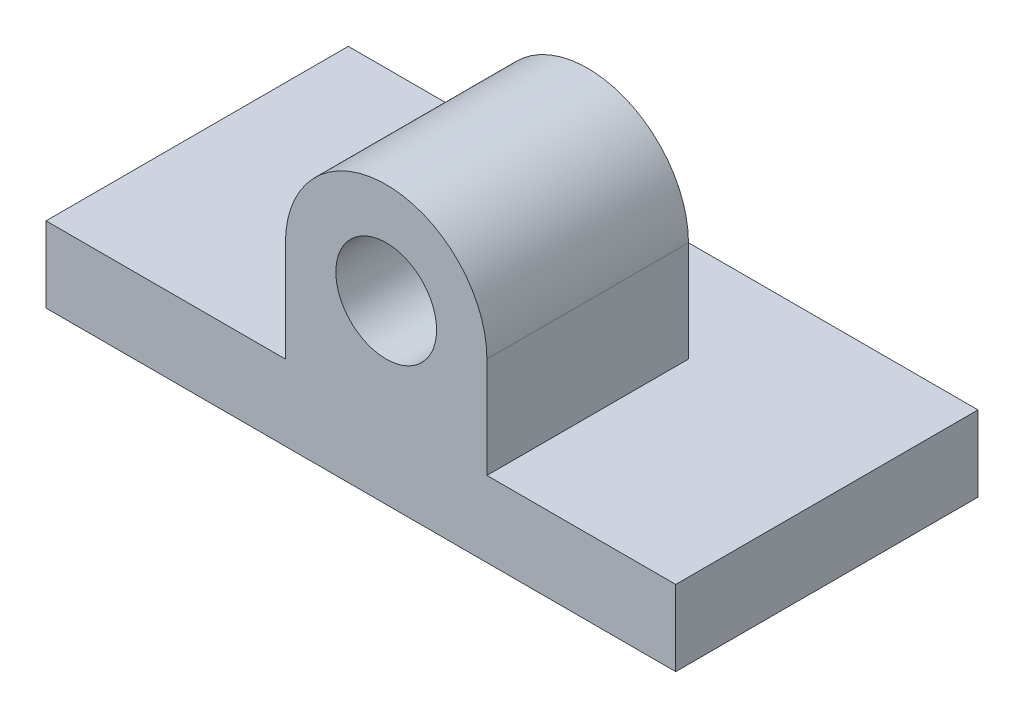
ISO-10303-21;
HEADER;
FILE_DESCRIPTION(('STEP AP214'),'2;1');
FILE_NAME('part.step','',(''),(''),'','','');
FILE_SCHEMA(('AUTOMOTIVE_DESIGN { 1 0 10303 214 1 1 1 1 }'));
ENDSEC;
DATA;
#1=APPLICATION_CONTEXT('core data for automotive mechanical design processes');
#2=APPLICATION_PROTOCOL_DEFINITION('international standard','automotive_design',2000,#1);
#3=PRODUCT_CONTEXT('',#1,'mechanical');
#4=PRODUCT('Part','Part','',(#3));
#5=PRODUCT_RELATED_PRODUCT_CATEGORY('part','',(#4));
#6=PRODUCT_DEFINITION_FORMATION('','',#4);
#7=PRODUCT_DEFINITION_CONTEXT('part definition',#1,'design');
#8=PRODUCT_DEFINITION('design','',#6,#7);
#9=PRODUCT_DEFINITION_SHAPE('','',#8);
#10=(LENGTH_UNIT() NAMED_UNIT(*) SI_UNIT(.MILLI.,.METRE.));
#11=(NAMED_UNIT(*) PLANE_ANGLE_UNIT() SI_UNIT($,.RADIAN.));
#12=(NAMED_UNIT(*) SI_UNIT($,.STERADIAN.) SOLID_ANGLE_UNIT());
#13=UNCERTAINTY_MEASURE_WITH_UNIT(LENGTH_MEASURE(1.E-05),#10,'distance_accuracy_value','');
#14=(GEOMETRIC_REPRESENTATION_CONTEXT(3) GLOBAL_UNCERTAINTY_ASSIGNED_CONTEXT((#13)) GLOBAL_UNIT_ASSIGNED_CONTEXT((#10,
#11,#12)) REPRESENTATION_CONTEXT('',''));
#15=CARTESIAN_POINT('',(0.,0.,0.));
#16=DIRECTION('',(0.,0.,1.));
#17=DIRECTION('',(1.,0.,0.));
#18=AXIS2_PLACEMENT_3D('',#15,#16,#17);
#19=CARTESIAN_POINT('',(0.,15.,-60.));
#20=DIRECTION('',(0.,-1.,0.));
#21=DIRECTION('',(0.,0.,-1.));
#22=AXIS2_PLACEMENT_3D('',#19,#20,#21);
#23=PLANE('',#22);
#24=DIRECTION('',(0.,0.,1.));
#25=VECTOR('',#24,1.);
#26=CARTESIAN_POINT('',(47.527127472847,15.,-40.));
#27=LINE('',#26,#25);
#28=CARTESIAN_POINT('',(47.527127472847,15.,-40.));
#29=VERTEX_POINT('',#28);
#30=CARTESIAN_POINT('',(47.527127472847,15.,0.));
#31=VERTEX_POINT('',#30);
#32=EDGE_CURVE('E131',#29,#31,#27,.T.);
#33=ORIENTED_EDGE('',*,*,#32,.F.);
#34=DIRECTION('',(1.,0.,0.));
#35=VECTOR('',#34,1.);
#36=CARTESIAN_POINT('',(0.,15.,-40.));
#37=LINE('',#36,#35);
#38=CARTESIAN_POINT('',(87.5271274728471,15.,-40.));
#39=VERTEX_POINT('',#38);
#40=EDGE_CURVE('E125',#29,#39,#37,.T.);
#41=ORIENTED_EDGE('',*,*,#40,.T.);
#42=DIRECTION('',(0.,0.,1.));
#43=VECTOR('',#42,1.);
#44=CARTESIAN_POINT('',(87.5271274728471,15.,-40.));
#45=LINE('',#44,#43);
#46=CARTESIAN_POINT('',(87.5271274728471,15.,0.));
#47=VERTEX_POINT('',#46);
#48=EDGE_CURVE('E154',#39,#47,#45,.T.);
#49=ORIENTED_EDGE('',*,*,#48,.T.);
#50=DIRECTION('',(1.,0.,0.));
#51=VECTOR('',#50,1.);
#52=CARTESIAN_POINT('',(0.,15.,0.));
#53=LINE('',#52,#51);
#54=CARTESIAN_POINT('',(125.,15.,0.));
#55=VERTEX_POINT('',#54);
#56=EDGE_CURVE('E169',#47,#55,#53,.T.);
#57=ORIENTED_EDGE('',*,*,#56,.T.);
#58=DIRECTION('',(0.,0.,1.));
#59=VECTOR('',#58,1.);
#60=CARTESIAN_POINT('',(125.,15.,-60.));
#61=LINE('',#60,#59);
#62=CARTESIAN_POINT('',(125.,15.,-60.));
#63=VERTEX_POINT('',#62);
#64=EDGE_CURVE('E47',#63,#55,#61,.T.);
#65=ORIENTED_EDGE('',*,*,#64,.F.);
#66=DIRECTION('',(1.,0.,0.));
#67=VECTOR('',#66,1.);
#68=CARTESIAN_POINT('',(0.,15.,-60.));
#69=LINE('',#68,#67);
#70=CARTESIAN_POINT('',(0.,15.,-60.));
#71=VERTEX_POINT('',#70);
#72=EDGE_CURVE('E93',#71,#63,#69,.T.);
#73=ORIENTED_EDGE('',*,*,#72,.F.);
#74=DIRECTION('',(0.,0.,1.));
#75=VECTOR('',#74,1.);
#76=CARTESIAN_POINT('',(0.,15.,-60.));
#77=LINE('',#76,#75);
#78=CARTESIAN_POINT('',(0.,15.,0.));
#79=VERTEX_POINT('',#78);
#80=EDGE_CURVE('E11',#71,#79,#77,.T.);
#81=ORIENTED_EDGE('',*,*,#80,.T.);
#82=EDGE_CURVE('E166',#79,#31,#53,.T.);
#83=ORIENTED_EDGE('',*,*,#82,.T.);
#84=EDGE_LOOP('',(#33,#41,#49,#57,#65,#73,#81,#83));
#85=FACE_BOUND('',#84,.T.);
#86=ADVANCED_FACE('F41',(#85),#23,.F.);
#87=CARTESIAN_POINT('',(0.,0.,-60.));
#88=DIRECTION('',(1.,0.,0.));
#89=DIRECTION('',(0.,0.,-1.));
#90=AXIS2_PLACEMENT_3D('',#87,#88,#89);
#91=PLANE('',#90);
#92=DIRECTION('',(0.,1.,0.));
#93=VECTOR('',#92,1.);
#94=CARTESIAN_POINT('',(0.,0.,0.));
#95=LINE('',#94,#93);
#96=CARTESIAN_POINT('',(0.,0.,0.));
#97=VERTEX_POINT('',#96);
#98=EDGE_CURVE('E152',#97,#79,#95,.T.);
#99=ORIENTED_EDGE('',*,*,#98,.T.);
#100=ORIENTED_EDGE('',*,*,#80,.F.);
#101=DIRECTION('',(0.,1.,0.));
#102=VECTOR('',#101,1.);
#103=CARTESIAN_POINT('',(0.,0.,-60.));
#104=LINE('',#103,#102);
#105=CARTESIAN_POINT('',(0.,0.,-60.));
#106=VERTEX_POINT('',#105);
#107=EDGE_CURVE('E158',#106,#71,#104,.T.);
#108=ORIENTED_EDGE('',*,*,#107,.F.);
#109=DIRECTION('',(0.,0.,1.));
#110=VECTOR('',#109,1.);
#111=CARTESIAN_POINT('',(0.,0.,-60.));
#112=LINE('',#111,#110);
#113=EDGE_CURVE('E63',#106,#97,#112,.T.);
#114=ORIENTED_EDGE('',*,*,#113,.T.);
#115=EDGE_LOOP('',(#99,#100,#108,#114));
#116=FACE_BOUND('',#115,.T.);
#117=ADVANCED_FACE('F43',(#116),#91,.F.);
#118=CARTESIAN_POINT('',(125.,0.,-60.));
#119=DIRECTION('',(1.,0.,0.));
#120=DIRECTION('',(0.,0.,-1.));
#121=AXIS2_PLACEMENT_3D('',#118,#119,#120);
#122=PLANE('',#121);
#123=DIRECTION('',(0.,1.,0.));
#124=VECTOR('',#123,1.);
#125=CARTESIAN_POINT('',(125.,0.,0.));
#126=LINE('',#125,#124);
#127=CARTESIAN_POINT('',(125.,0.,0.));
#128=VERTEX_POINT('',#127);
#129=EDGE_CURVE('E175',#128,#55,#126,.T.);
#130=ORIENTED_EDGE('',*,*,#129,.F.);
#131=DIRECTION('',(0.,0.,1.));
#132=VECTOR('',#131,1.);
#133=CARTESIAN_POINT('',(125.,0.,-60.));
#134=LINE('',#133,#132);
#135=CARTESIAN_POINT('',(125.,0.,-60.));
#136=VERTEX_POINT('',#135);
#137=EDGE_CURVE('E177',#136,#128,#134,.T.);
#138=ORIENTED_EDGE('',*,*,#137,.F.);
#139=DIRECTION('',(0.,1.,0.));
#140=VECTOR('',#139,1.);
#141=CARTESIAN_POINT('',(125.,0.,-60.));
#142=LINE('',#141,#140);
#143=EDGE_CURVE('E165',#136,#63,#142,.T.);
#144=ORIENTED_EDGE('',*,*,#143,.T.);
#145=ORIENTED_EDGE('',*,*,#64,.T.);
#146=EDGE_LOOP('',(#130,#138,#144,#145));
#147=FACE_BOUND('',#146,.T.);
#148=ADVANCED_FACE('F185',(#147),#122,.T.);
#149=CARTESIAN_POINT('',(0.,0.,-60.));
#150=DIRECTION('',(0.,-1.,0.));
#151=DIRECTION('',(0.,0.,-1.));
#152=AXIS2_PLACEMENT_3D('',#149,#150,#151);
#153=PLANE('',#152);
#154=DIRECTION('',(1.,0.,0.));
#155=VECTOR('',#154,1.);
#156=CARTESIAN_POINT('',(0.,0.,0.));
#157=LINE('',#156,#155);
#158=EDGE_CURVE('E159',#97,#128,#157,.T.);
#159=ORIENTED_EDGE('',*,*,#158,.F.);
#160=ORIENTED_EDGE('',*,*,#113,.F.);
#161=DIRECTION('',(1.,0.,0.));
#162=VECTOR('',#161,1.);
#163=CARTESIAN_POINT('',(0.,0.,-60.));
#164=LINE('',#163,#162);
#165=EDGE_CURVE('E164',#106,#136,#164,.T.);
#166=ORIENTED_EDGE('',*,*,#165,.T.);
#167=ORIENTED_EDGE('',*,*,#137,.T.);
#168=EDGE_LOOP('',(#159,#160,#166,#167));
#169=FACE_BOUND('',#168,.T.);
#170=ADVANCED_FACE('F189',(#169),#153,.T.);
#171=CARTESIAN_POINT('',(0.,0.,-60.));
#172=DIRECTION('',(0.,0.,-1.));
#173=DIRECTION('',(-1.,0.,0.));
#174=AXIS2_PLACEMENT_3D('',#171,#172,#173);
#175=PLANE('',#174);
#176=ORIENTED_EDGE('',*,*,#107,.T.);
#177=ORIENTED_EDGE('',*,*,#72,.T.);
#178=ORIENTED_EDGE('',*,*,#143,.F.);
#179=ORIENTED_EDGE('',*,*,#165,.F.);
#180=EDGE_LOOP('',(#176,#177,#178,#179));
#181=FACE_BOUND('',#180,.T.);
#182=ADVANCED_FACE('F191',(#181),#175,.T.);
#183=CARTESIAN_POINT('',(0.,0.,0.));
#184=DIRECTION('',(0.,0.,-1.));
#185=DIRECTION('',(-1.,0.,0.));
#186=AXIS2_PLACEMENT_3D('',#183,#184,#185);
#187=PLANE('',#186);
#188=ORIENTED_EDGE('',*,*,#98,.F.);
#189=ORIENTED_EDGE('',*,*,#158,.T.);
#190=ORIENTED_EDGE('',*,*,#129,.T.);
#191=ORIENTED_EDGE('',*,*,#56,.F.);
#192=DIRECTION('',(0.,1.,0.));
#193=VECTOR('',#192,1.);
#194=CARTESIAN_POINT('',(87.5271274728471,0.,0.));
#195=LINE('',#194,#193);
#196=CARTESIAN_POINT('',(87.5271274728471,35.,0.));
#197=VERTEX_POINT('',#196);
#198=EDGE_CURVE('E57',#47,#197,#195,.T.);
#199=ORIENTED_EDGE('',*,*,#198,.T.);
#200=CARTESIAN_POINT('',(67.527127472847,35.,0.));
#201=DIRECTION('',(0.,0.,1.));
#202=DIRECTION('',(1.,0.,0.));
#203=AXIS2_PLACEMENT_3D('',#200,#201,#202);
#204=CIRCLE('',#203,20.);
#205=CARTESIAN_POINT('',(47.527127472847,35.,0.));
#206=VERTEX_POINT('',#205);
#207=EDGE_CURVE('E149',#197,#206,#204,.T.);
#208=ORIENTED_EDGE('',*,*,#207,.T.);
#209=DIRECTION('',(0.,1.,0.));
#210=VECTOR('',#209,1.);
#211=CARTESIAN_POINT('',(47.527127472847,0.,0.));
#212=LINE('',#211,#210);
#213=EDGE_CURVE('E128',#31,#206,#212,.T.);
#214=ORIENTED_EDGE('',*,*,#213,.F.);
#215=ORIENTED_EDGE('',*,*,#82,.F.);
#216=EDGE_LOOP('',(#188,#189,#190,#191,#199,#208,#214,#215));
#217=FACE_BOUND('',#216,.T.);
#218=CARTESIAN_POINT('',(67.527127472847,35.,0.));
#219=DIRECTION('',(0.,0.,1.));
#220=DIRECTION('',(1.,0.,0.));
#221=AXIS2_PLACEMENT_3D('',#218,#219,#220);
#222=CIRCLE('',#221,9.99999999999999);
#223=CARTESIAN_POINT('',(77.527127472847,35.,0.));
#224=VERTEX_POINT('',#223);
#225=EDGE_CURVE('E148',#224,#224,#222,.T.);
#226=ORIENTED_EDGE('',*,*,#225,.F.);
#227=EDGE_LOOP('',(#226));
#228=FACE_BOUND('',#227,.T.);
#229=ADVANCED_FACE('F187',(#217,#228),#187,.F.);
#230=CARTESIAN_POINT('',(67.527127472847,35.,-40.));
#231=DIRECTION('',(0.,0.,1.));
#232=DIRECTION('',(1.,0.,0.));
#233=AXIS2_PLACEMENT_3D('',#230,#231,#232);
#234=CYLINDRICAL_SURFACE('',#233,20.);
#235=ORIENTED_EDGE('',*,*,#207,.F.);
#236=DIRECTION('',(0.,0.,1.));
#237=VECTOR('',#236,1.);
#238=CARTESIAN_POINT('',(87.5271274728471,35.,-40.));
#239=LINE('',#238,#237);
#240=CARTESIAN_POINT('',(87.5271274728471,35.,-40.));
#241=VERTEX_POINT('',#240);
#242=EDGE_CURVE('E137',#241,#197,#239,.T.);
#243=ORIENTED_EDGE('',*,*,#242,.F.);
#244=CARTESIAN_POINT('',(67.527127472847,35.,-40.));
#245=DIRECTION('',(0.,0.,1.));
#246=DIRECTION('',(1.,0.,0.));
#247=AXIS2_PLACEMENT_3D('',#244,#245,#246);
#248=CIRCLE('',#247,20.);
#249=CARTESIAN_POINT('',(47.527127472847,35.,-40.));
#250=VERTEX_POINT('',#249);
#251=EDGE_CURVE('E116',#241,#250,#248,.T.);
#252=ORIENTED_EDGE('',*,*,#251,.T.);
#253=DIRECTION('',(0.,0.,1.));
#254=VECTOR('',#253,1.);
#255=CARTESIAN_POINT('',(47.527127472847,35.,-40.));
#256=LINE('',#255,#254);
#257=EDGE_CURVE('E130',#250,#206,#256,.T.);
#258=ORIENTED_EDGE('',*,*,#257,.T.);
#259=EDGE_LOOP('',(#235,#243,#252,#258));
#260=FACE_BOUND('',#259,.T.);
#261=ADVANCED_FACE('F140',(#260),#234,.T.);
#262=CARTESIAN_POINT('',(87.5271274728471,0.,-40.));
#263=DIRECTION('',(1.,0.,0.));
#264=DIRECTION('',(0.,0.,-1.));
#265=AXIS2_PLACEMENT_3D('',#262,#263,#264);
#266=PLANE('',#265);
#267=ORIENTED_EDGE('',*,*,#198,.F.);
#268=ORIENTED_EDGE('',*,*,#48,.F.);
#269=DIRECTION('',(0.,1.,0.));
#270=VECTOR('',#269,1.);
#271=CARTESIAN_POINT('',(87.5271274728471,0.,-40.));
#272=LINE('',#271,#270);
#273=EDGE_CURVE('E133',#39,#241,#272,.T.);
#274=ORIENTED_EDGE('',*,*,#273,.T.);
#275=ORIENTED_EDGE('',*,*,#242,.T.);
#276=EDGE_LOOP('',(#267,#268,#274,#275));
#277=FACE_BOUND('',#276,.T.);
#278=ADVANCED_FACE('F192',(#277),#266,.T.);
#279=CARTESIAN_POINT('',(67.527127472847,35.,-40.));
#280=DIRECTION('',(0.,0.,1.));
#281=DIRECTION('',(1.,0.,0.));
#282=AXIS2_PLACEMENT_3D('',#279,#280,#281);
#283=CYLINDRICAL_SURFACE('',#282,9.99999999999999);
#284=CARTESIAN_POINT('',(67.527127472847,35.,-40.));
#285=DIRECTION('',(0.,0.,1.));
#286=DIRECTION('',(1.,0.,0.));
#287=AXIS2_PLACEMENT_3D('',#284,#285,#286);
#288=CIRCLE('',#287,9.99999999999999);
#289=CARTESIAN_POINT('',(77.527127472847,35.,-40.));
#290=VERTEX_POINT('',#289);
#291=EDGE_CURVE('E138',#290,#290,#288,.T.);
#292=ORIENTED_EDGE('',*,*,#291,.F.);
#293=EDGE_LOOP('',(#292));
#294=FACE_BOUND('',#293,.T.);
#295=ORIENTED_EDGE('',*,*,#225,.T.);
#296=EDGE_LOOP('',(#295));
#297=FACE_BOUND('',#296,.T.);
#298=ADVANCED_FACE('F194',(#294,#297),#283,.F.);
#299=CARTESIAN_POINT('',(47.527127472847,0.,-40.));
#300=DIRECTION('',(1.,0.,0.));
#301=DIRECTION('',(0.,0.,-1.));
#302=AXIS2_PLACEMENT_3D('',#299,#300,#301);
#303=PLANE('',#302);
#304=ORIENTED_EDGE('',*,*,#213,.T.);
#305=ORIENTED_EDGE('',*,*,#257,.F.);
#306=DIRECTION('',(0.,1.,0.));
#307=VECTOR('',#306,1.);
#308=CARTESIAN_POINT('',(47.527127472847,0.,-40.));
#309=LINE('',#308,#307);
#310=EDGE_CURVE('E111',#29,#250,#309,.T.);
#311=ORIENTED_EDGE('',*,*,#310,.F.);
#312=ORIENTED_EDGE('',*,*,#32,.T.);
#313=EDGE_LOOP('',(#304,#305,#311,#312));
#314=FACE_BOUND('',#313,.T.);
#315=ADVANCED_FACE('F126',(#314),#303,.F.);
#316=CARTESIAN_POINT('',(0.,0.,-40.));
#317=DIRECTION('',(0.,0.,1.));
#318=DIRECTION('',(1.,0.,0.));
#319=AXIS2_PLACEMENT_3D('',#316,#317,#318);
#320=PLANE('',#319);
#321=ORIENTED_EDGE('',*,*,#291,.T.);
#322=EDGE_LOOP('',(#321));
#323=FACE_BOUND('',#322,.T.);
#324=ORIENTED_EDGE('',*,*,#251,.F.);
#325=ORIENTED_EDGE('',*,*,#273,.F.);
#326=ORIENTED_EDGE('',*,*,#40,.F.);
#327=ORIENTED_EDGE('',*,*,#310,.T.);
#328=EDGE_LOOP('',(#324,#325,#326,#327));
#329=FACE_BOUND('',#328,.T.);
#330=ADVANCED_FACE('F117',(#323,#329),#320,.F.);
#331=CLOSED_SHELL('',(#86,#117,#148,#170,#182,#229,#261,#278,#298,#315,#330));
#332=MANIFOLD_SOLID_BREP('B2',#331);
#333=ADVANCED_BREP_SHAPE_REPRESENTATION('',(#18,#332),#14);
#334=SHAPE_DEFINITION_REPRESENTATION(#9,#333);
ENDSEC;
END-ISO-10303-21;
